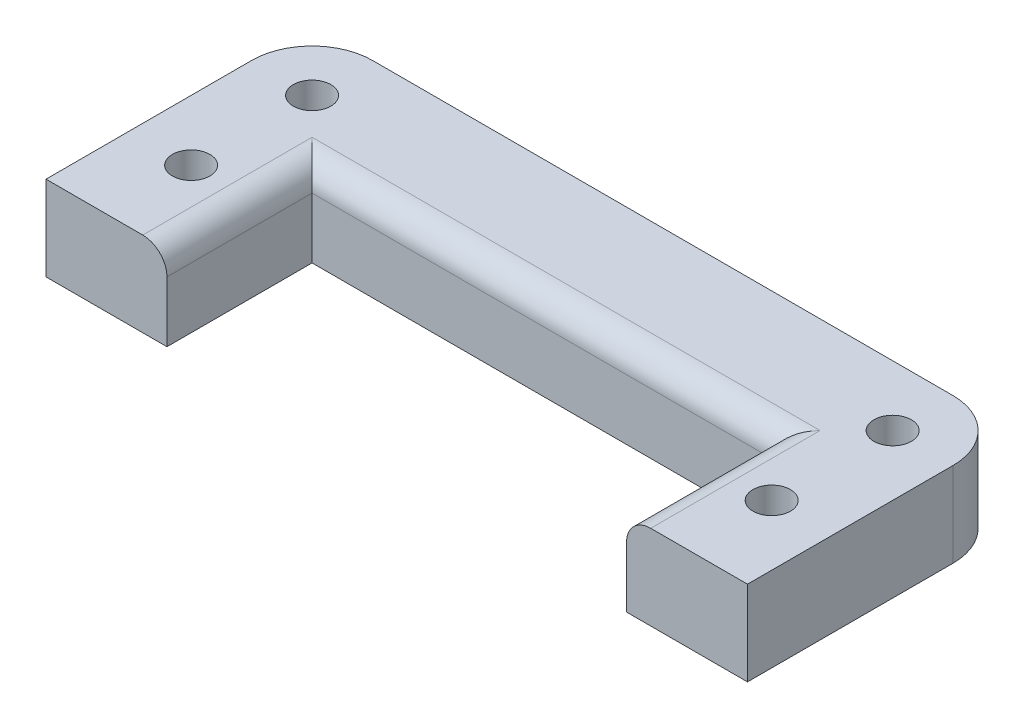
ISO-10303-21;
HEADER;
FILE_DESCRIPTION(('STEP AP214'),'2;1');
FILE_NAME('part.step','',(''),(''),'','','');
FILE_SCHEMA(('AUTOMOTIVE_DESIGN { 1 0 10303 214 1 1 1 1 }'));
ENDSEC;
DATA;
#1=APPLICATION_CONTEXT('core data for automotive mechanical design processes');
#2=APPLICATION_PROTOCOL_DEFINITION('international standard','automotive_design',2000,#1);
#3=PRODUCT_CONTEXT('',#1,'mechanical');
#4=PRODUCT('Part','Part','',(#3));
#5=PRODUCT_RELATED_PRODUCT_CATEGORY('part','',(#4));
#6=PRODUCT_DEFINITION_FORMATION('','',#4);
#7=PRODUCT_DEFINITION_CONTEXT('part definition',#1,'design');
#8=PRODUCT_DEFINITION('design','',#6,#7);
#9=PRODUCT_DEFINITION_SHAPE('','',#8);
#10=(LENGTH_UNIT() NAMED_UNIT(*) SI_UNIT(.MILLI.,.METRE.));
#11=(NAMED_UNIT(*) PLANE_ANGLE_UNIT() SI_UNIT($,.RADIAN.));
#12=(NAMED_UNIT(*) SI_UNIT($,.STERADIAN.) SOLID_ANGLE_UNIT());
#13=UNCERTAINTY_MEASURE_WITH_UNIT(LENGTH_MEASURE(1.E-05),#10,'distance_accuracy_value','');
#14=(GEOMETRIC_REPRESENTATION_CONTEXT(3) GLOBAL_UNCERTAINTY_ASSIGNED_CONTEXT((#13)) GLOBAL_UNIT_ASSIGNED_CONTEXT((#10,
#11,#12)) REPRESENTATION_CONTEXT('',''));
#15=CARTESIAN_POINT('',(0.,0.,0.));
#16=DIRECTION('',(0.,0.,1.));
#17=DIRECTION('',(1.,0.,0.));
#18=AXIS2_PLACEMENT_3D('',#15,#16,#17);
#19=CARTESIAN_POINT('',(0.,7.,0.));
#20=DIRECTION('',(0.,-1.,0.));
#21=DIRECTION('',(0.,0.,-1.));
#22=AXIS2_PLACEMENT_3D('',#19,#20,#21);
#23=PLANE('',#22);
#24=DIRECTION('',(-1.,0.,0.));
#25=VECTOR('',#24,1.);
#26=CARTESIAN_POINT('',(-29.,7.,-15.));
#27=LINE('',#26,#25);
#28=CARTESIAN_POINT('',(24.,7.,-15.));
#29=VERTEX_POINT('',#28);
#30=CARTESIAN_POINT('',(-24.,7.,-15.));
#31=VERTEX_POINT('',#30);
#32=EDGE_CURVE('E160',#29,#31,#27,.T.);
#33=ORIENTED_EDGE('',*,*,#32,.T.);
#34=CARTESIAN_POINT('',(-24.,7.,-10.));
#35=DIRECTION('',(0.,-1.,0.));
#36=DIRECTION('',(0.,0.,-1.));
#37=AXIS2_PLACEMENT_3D('',#34,#35,#36);
#38=CIRCLE('',#37,5.);
#39=CARTESIAN_POINT('',(-29.,7.,-9.99999999999999));
#40=VERTEX_POINT('',#39);
#41=EDGE_CURVE('E54',#31,#40,#38,.F.);
#42=ORIENTED_EDGE('',*,*,#41,.T.);
#43=DIRECTION('',(0.,0.,1.));
#44=VECTOR('',#43,1.);
#45=CARTESIAN_POINT('',(-29.,7.,7.00000000000001));
#46=LINE('',#45,#44);
#47=CARTESIAN_POINT('',(-29.,7.,7.00000000000001));
#48=VERTEX_POINT('',#47);
#49=EDGE_CURVE('E163',#40,#48,#46,.T.);
#50=ORIENTED_EDGE('',*,*,#49,.T.);
#51=DIRECTION('',(1.,0.,0.));
#52=VECTOR('',#51,1.);
#53=CARTESIAN_POINT('',(-19.,7.,7.));
#54=LINE('',#53,#52);
#55=CARTESIAN_POINT('',(-21.,7.,7.00000000000001));
#56=VERTEX_POINT('',#55);
#57=EDGE_CURVE('E146',#48,#56,#54,.T.);
#58=ORIENTED_EDGE('',*,*,#57,.T.);
#59=DIRECTION('',(0.,0.,-1.));
#60=VECTOR('',#59,1.);
#61=CARTESIAN_POINT('',(-21.,7.,0.));
#62=LINE('',#61,#60);
#63=CARTESIAN_POINT('',(-21.,7.,-6.99999999999999));
#64=VERTEX_POINT('',#63);
#65=EDGE_CURVE('E211',#56,#64,#62,.T.);
#66=ORIENTED_EDGE('',*,*,#65,.T.);
#67=DIRECTION('',(1.,0.,0.));
#68=VECTOR('',#67,1.);
#69=CARTESIAN_POINT('',(0.,7.,-6.99999999999999));
#70=LINE('',#69,#68);
#71=CARTESIAN_POINT('',(21.,7.,-6.99999999999999));
#72=VERTEX_POINT('',#71);
#73=EDGE_CURVE('E214',#64,#72,#70,.T.);
#74=ORIENTED_EDGE('',*,*,#73,.T.);
#75=DIRECTION('',(0.,0.,1.));
#76=VECTOR('',#75,1.);
#77=CARTESIAN_POINT('',(21.,7.,0.));
#78=LINE('',#77,#76);
#79=CARTESIAN_POINT('',(21.,7.,7.));
#80=VERTEX_POINT('',#79);
#81=EDGE_CURVE('E143',#72,#80,#78,.T.);
#82=ORIENTED_EDGE('',*,*,#81,.T.);
#83=DIRECTION('',(1.,0.,0.));
#84=VECTOR('',#83,1.);
#85=CARTESIAN_POINT('',(29.,7.,7.));
#86=LINE('',#85,#84);
#87=CARTESIAN_POINT('',(29.,7.,7.));
#88=VERTEX_POINT('',#87);
#89=EDGE_CURVE('E137',#80,#88,#86,.T.);
#90=ORIENTED_EDGE('',*,*,#89,.T.);
#91=DIRECTION('',(0.,0.,-1.));
#92=VECTOR('',#91,1.);
#93=CARTESIAN_POINT('',(29.,7.,-15.));
#94=LINE('',#93,#92);
#95=CARTESIAN_POINT('',(29.,7.,-10.));
#96=VERTEX_POINT('',#95);
#97=EDGE_CURVE('E140',#88,#96,#94,.T.);
#98=ORIENTED_EDGE('',*,*,#97,.T.);
#99=CARTESIAN_POINT('',(24.,7.,-10.));
#100=DIRECTION('',(0.,-1.,0.));
#101=DIRECTION('',(0.,0.,-1.));
#102=AXIS2_PLACEMENT_3D('',#99,#100,#101);
#103=CIRCLE('',#102,5.);
#104=EDGE_CURVE('E259',#96,#29,#103,.F.);
#105=ORIENTED_EDGE('',*,*,#104,.T.);
#106=EDGE_LOOP('',(#33,#42,#50,#58,#66,#74,#82,#90,#98,#105));
#107=FACE_BOUND('',#106,.T.);
#108=CARTESIAN_POINT('',(-24.,7.,0.));
#109=DIRECTION('',(0.,1.,0.));
#110=DIRECTION('',(0.,0.,1.));
#111=AXIS2_PLACEMENT_3D('',#108,#109,#110);
#112=CIRCLE('',#111,1.55);
#113=CARTESIAN_POINT('',(-24.,7.,1.55));
#114=VERTEX_POINT('',#113);
#115=EDGE_CURVE('E174',#114,#114,#112,.T.);
#116=ORIENTED_EDGE('',*,*,#115,.F.);
#117=EDGE_LOOP('',(#116));
#118=FACE_BOUND('',#117,.T.);
#119=CARTESIAN_POINT('',(24.,7.,0.));
#120=DIRECTION('',(0.,1.,0.));
#121=DIRECTION('',(0.,0.,1.));
#122=AXIS2_PLACEMENT_3D('',#119,#120,#121);
#123=CIRCLE('',#122,1.55);
#124=CARTESIAN_POINT('',(24.,7.,1.55));
#125=VERTEX_POINT('',#124);
#126=EDGE_CURVE('E307',#125,#125,#123,.T.);
#127=ORIENTED_EDGE('',*,*,#126,.F.);
#128=EDGE_LOOP('',(#127));
#129=FACE_BOUND('',#128,.T.);
#130=CARTESIAN_POINT('',(-24.,7.,-10.));
#131=DIRECTION('',(0.,1.,0.));
#132=DIRECTION('',(0.,0.,1.));
#133=AXIS2_PLACEMENT_3D('',#130,#131,#132);
#134=CIRCLE('',#133,1.55);
#135=CARTESIAN_POINT('',(-24.,7.,-8.45));
#136=VERTEX_POINT('',#135);
#137=EDGE_CURVE('E315',#136,#136,#134,.T.);
#138=ORIENTED_EDGE('',*,*,#137,.F.);
#139=EDGE_LOOP('',(#138));
#140=FACE_BOUND('',#139,.T.);
#141=CARTESIAN_POINT('',(24.,7.,-10.));
#142=DIRECTION('',(0.,1.,0.));
#143=DIRECTION('',(0.,0.,1.));
#144=AXIS2_PLACEMENT_3D('',#141,#142,#143);
#145=CIRCLE('',#144,1.55);
#146=CARTESIAN_POINT('',(24.,7.,-8.45));
#147=VERTEX_POINT('',#146);
#148=EDGE_CURVE('E323',#147,#147,#145,.T.);
#149=ORIENTED_EDGE('',*,*,#148,.F.);
#150=EDGE_LOOP('',(#149));
#151=FACE_BOUND('',#150,.T.);
#152=ADVANCED_FACE('F45',(#107,#118,#129,#140,#151),#23,.F.);
#153=CARTESIAN_POINT('',(0.,0.,0.));
#154=DIRECTION('',(0.,-1.,0.));
#155=DIRECTION('',(0.,0.,-1.));
#156=AXIS2_PLACEMENT_3D('',#153,#154,#155);
#157=PLANE('',#156);
#158=CARTESIAN_POINT('',(-24.,0.,-10.));
#159=DIRECTION('',(0.,1.,0.));
#160=DIRECTION('',(0.,0.,1.));
#161=AXIS2_PLACEMENT_3D('',#158,#159,#160);
#162=CIRCLE('',#161,1.55);
#163=CARTESIAN_POINT('',(-24.,0.,-8.45));
#164=VERTEX_POINT('',#163);
#165=EDGE_CURVE('E319',#164,#164,#162,.T.);
#166=ORIENTED_EDGE('',*,*,#165,.T.);
#167=EDGE_LOOP('',(#166));
#168=FACE_BOUND('',#167,.T.);
#169=CARTESIAN_POINT('',(-24.,0.,0.));
#170=DIRECTION('',(0.,1.,0.));
#171=DIRECTION('',(0.,0.,1.));
#172=AXIS2_PLACEMENT_3D('',#169,#170,#171);
#173=CIRCLE('',#172,1.55);
#174=CARTESIAN_POINT('',(-24.,0.,1.55));
#175=VERTEX_POINT('',#174);
#176=EDGE_CURVE('E303',#175,#175,#173,.T.);
#177=ORIENTED_EDGE('',*,*,#176,.T.);
#178=EDGE_LOOP('',(#177));
#179=FACE_BOUND('',#178,.T.);
#180=DIRECTION('',(0.,0.,1.));
#181=VECTOR('',#180,1.);
#182=CARTESIAN_POINT('',(-29.,0.,7.00000000000001));
#183=LINE('',#182,#181);
#184=CARTESIAN_POINT('',(-29.,0.,-9.99999999999999));
#185=VERTEX_POINT('',#184);
#186=CARTESIAN_POINT('',(-29.,0.,7.00000000000001));
#187=VERTEX_POINT('',#186);
#188=EDGE_CURVE('E194',#185,#187,#183,.T.);
#189=ORIENTED_EDGE('',*,*,#188,.F.);
#190=CARTESIAN_POINT('',(-24.,0.,-10.));
#191=DIRECTION('',(0.,-1.,0.));
#192=DIRECTION('',(0.,0.,-1.));
#193=AXIS2_PLACEMENT_3D('',#190,#191,#192);
#194=CIRCLE('',#193,5.);
#195=CARTESIAN_POINT('',(-24.,0.,-15.));
#196=VERTEX_POINT('',#195);
#197=EDGE_CURVE('E250',#185,#196,#194,.T.);
#198=ORIENTED_EDGE('',*,*,#197,.T.);
#199=DIRECTION('',(-1.,0.,0.));
#200=VECTOR('',#199,1.);
#201=CARTESIAN_POINT('',(-29.,0.,-15.));
#202=LINE('',#201,#200);
#203=CARTESIAN_POINT('',(24.,0.,-15.));
#204=VERTEX_POINT('',#203);
#205=EDGE_CURVE('E191',#204,#196,#202,.T.);
#206=ORIENTED_EDGE('',*,*,#205,.F.);
#207=CARTESIAN_POINT('',(24.,0.,-10.));
#208=DIRECTION('',(0.,-1.,0.));
#209=DIRECTION('',(0.,0.,-1.));
#210=AXIS2_PLACEMENT_3D('',#207,#208,#209);
#211=CIRCLE('',#210,5.);
#212=CARTESIAN_POINT('',(29.,0.,-10.));
#213=VERTEX_POINT('',#212);
#214=EDGE_CURVE('E247',#204,#213,#211,.T.);
#215=ORIENTED_EDGE('',*,*,#214,.T.);
#216=DIRECTION('',(0.,0.,-1.));
#217=VECTOR('',#216,1.);
#218=CARTESIAN_POINT('',(29.,0.,-15.));
#219=LINE('',#218,#217);
#220=CARTESIAN_POINT('',(29.,0.,7.));
#221=VERTEX_POINT('',#220);
#222=EDGE_CURVE('E188',#221,#213,#219,.T.);
#223=ORIENTED_EDGE('',*,*,#222,.F.);
#224=DIRECTION('',(1.,0.,0.));
#225=VECTOR('',#224,1.);
#226=CARTESIAN_POINT('',(29.,0.,7.));
#227=LINE('',#226,#225);
#228=CARTESIAN_POINT('',(19.,0.,7.));
#229=VERTEX_POINT('',#228);
#230=EDGE_CURVE('E152',#229,#221,#227,.T.);
#231=ORIENTED_EDGE('',*,*,#230,.F.);
#232=DIRECTION('',(0.,0.,1.));
#233=VECTOR('',#232,1.);
#234=CARTESIAN_POINT('',(19.,0.,7.));
#235=LINE('',#234,#233);
#236=CARTESIAN_POINT('',(19.,0.,-4.99999999999999));
#237=VERTEX_POINT('',#236);
#238=EDGE_CURVE('E182',#237,#229,#235,.T.);
#239=ORIENTED_EDGE('',*,*,#238,.F.);
#240=DIRECTION('',(1.,0.,0.));
#241=VECTOR('',#240,1.);
#242=CARTESIAN_POINT('',(19.,0.,-4.99999999999999));
#243=LINE('',#242,#241);
#244=CARTESIAN_POINT('',(-19.,0.,-4.99999999999999));
#245=VERTEX_POINT('',#244);
#246=EDGE_CURVE('E178',#245,#237,#243,.T.);
#247=ORIENTED_EDGE('',*,*,#246,.F.);
#248=DIRECTION('',(0.,0.,-1.));
#249=VECTOR('',#248,1.);
#250=CARTESIAN_POINT('',(-19.,0.,-4.99999999999999));
#251=LINE('',#250,#249);
#252=CARTESIAN_POINT('',(-19.,0.,7.));
#253=VERTEX_POINT('',#252);
#254=EDGE_CURVE('E173',#253,#245,#251,.T.);
#255=ORIENTED_EDGE('',*,*,#254,.F.);
#256=DIRECTION('',(1.,0.,0.));
#257=VECTOR('',#256,1.);
#258=CARTESIAN_POINT('',(-19.,0.,7.));
#259=LINE('',#258,#257);
#260=EDGE_CURVE('E169',#187,#253,#259,.T.);
#261=ORIENTED_EDGE('',*,*,#260,.F.);
#262=EDGE_LOOP('',(#189,#198,#206,#215,#223,#231,#239,#247,#255,#261));
#263=FACE_BOUND('',#262,.T.);
#264=CARTESIAN_POINT('',(24.,0.,0.));
#265=DIRECTION('',(0.,1.,0.));
#266=DIRECTION('',(0.,0.,1.));
#267=AXIS2_PLACEMENT_3D('',#264,#265,#266);
#268=CIRCLE('',#267,1.55);
#269=CARTESIAN_POINT('',(24.,0.,1.55));
#270=VERTEX_POINT('',#269);
#271=EDGE_CURVE('E311',#270,#270,#268,.T.);
#272=ORIENTED_EDGE('',*,*,#271,.T.);
#273=EDGE_LOOP('',(#272));
#274=FACE_BOUND('',#273,.T.);
#275=CARTESIAN_POINT('',(24.,0.,-10.));
#276=DIRECTION('',(0.,1.,0.));
#277=DIRECTION('',(0.,0.,1.));
#278=AXIS2_PLACEMENT_3D('',#275,#276,#277);
#279=CIRCLE('',#278,1.55);
#280=CARTESIAN_POINT('',(24.,0.,-8.45));
#281=VERTEX_POINT('',#280);
#282=EDGE_CURVE('E243',#281,#281,#279,.T.);
#283=ORIENTED_EDGE('',*,*,#282,.T.);
#284=EDGE_LOOP('',(#283));
#285=FACE_BOUND('',#284,.T.);
#286=ADVANCED_FACE('F275',(#168,#179,#263,#274,#285),#157,.T.);
#287=CARTESIAN_POINT('',(-19.,7.,7.));
#288=DIRECTION('',(0.,0.,-1.));
#289=DIRECTION('',(-1.,0.,0.));
#290=AXIS2_PLACEMENT_3D('',#287,#288,#289);
#291=PLANE('',#290);
#292=DIRECTION('',(0.,-1.,0.));
#293=VECTOR('',#292,1.);
#294=CARTESIAN_POINT('',(-19.,7.,7.));
#295=LINE('',#294,#293);
#296=CARTESIAN_POINT('',(-19.,5.,7.));
#297=VERTEX_POINT('',#296);
#298=EDGE_CURVE('E208',#297,#253,#295,.T.);
#299=ORIENTED_EDGE('',*,*,#298,.F.);
#300=CARTESIAN_POINT('',(-21.,5.,7.00000000000001));
#301=DIRECTION('',(0.,0.,-1.));
#302=DIRECTION('',(-1.,0.,0.));
#303=AXIS2_PLACEMENT_3D('',#300,#301,#302);
#304=CIRCLE('',#303,2.);
#305=EDGE_CURVE('E231',#297,#56,#304,.F.);
#306=ORIENTED_EDGE('',*,*,#305,.T.);
#307=ORIENTED_EDGE('',*,*,#57,.F.);
#308=DIRECTION('',(0.,-1.,0.));
#309=VECTOR('',#308,1.);
#310=CARTESIAN_POINT('',(-29.,7.,7.00000000000001));
#311=LINE('',#310,#309);
#312=EDGE_CURVE('E156',#48,#187,#311,.T.);
#313=ORIENTED_EDGE('',*,*,#312,.T.);
#314=ORIENTED_EDGE('',*,*,#260,.T.);
#315=EDGE_LOOP('',(#299,#306,#307,#313,#314));
#316=FACE_BOUND('',#315,.T.);
#317=ADVANCED_FACE('F298',(#316),#291,.F.);
#318=CARTESIAN_POINT('',(-19.,7.,-4.99999999999999));
#319=DIRECTION('',(-1.,0.,0.));
#320=DIRECTION('',(0.,0.,1.));
#321=AXIS2_PLACEMENT_3D('',#318,#319,#320);
#322=PLANE('',#321);
#323=DIRECTION('',(0.,-1.,0.));
#324=VECTOR('',#323,1.);
#325=CARTESIAN_POINT('',(-19.,7.,-4.99999999999999));
#326=LINE('',#325,#324);
#327=CARTESIAN_POINT('',(-19.,5.,-4.99999999999999));
#328=VERTEX_POINT('',#327);
#329=EDGE_CURVE('E205',#328,#245,#326,.T.);
#330=ORIENTED_EDGE('',*,*,#329,.F.);
#331=DIRECTION('',(0.,0.,-1.));
#332=VECTOR('',#331,1.);
#333=CARTESIAN_POINT('',(-19.,5.,-4.99999999999999));
#334=LINE('',#333,#332);
#335=EDGE_CURVE('E228',#328,#297,#334,.F.);
#336=ORIENTED_EDGE('',*,*,#335,.T.);
#337=ORIENTED_EDGE('',*,*,#298,.T.);
#338=ORIENTED_EDGE('',*,*,#254,.T.);
#339=EDGE_LOOP('',(#330,#336,#337,#338));
#340=FACE_BOUND('',#339,.T.);
#341=ADVANCED_FACE('F295',(#340),#322,.F.);
#342=CARTESIAN_POINT('',(19.,7.,-4.99999999999999));
#343=DIRECTION('',(0.,0.,-1.));
#344=DIRECTION('',(-1.,0.,0.));
#345=AXIS2_PLACEMENT_3D('',#342,#343,#344);
#346=PLANE('',#345);
#347=DIRECTION('',(0.,-1.,0.));
#348=VECTOR('',#347,1.);
#349=CARTESIAN_POINT('',(19.,7.,-4.99999999999999));
#350=LINE('',#349,#348);
#351=CARTESIAN_POINT('',(19.,5.,-4.99999999999999));
#352=VERTEX_POINT('',#351);
#353=EDGE_CURVE('E202',#352,#237,#350,.T.);
#354=ORIENTED_EDGE('',*,*,#353,.F.);
#355=DIRECTION('',(1.,0.,0.));
#356=VECTOR('',#355,1.);
#357=CARTESIAN_POINT('',(19.,5.,-4.99999999999999));
#358=LINE('',#357,#356);
#359=EDGE_CURVE('E225',#352,#328,#358,.F.);
#360=ORIENTED_EDGE('',*,*,#359,.T.);
#361=ORIENTED_EDGE('',*,*,#329,.T.);
#362=ORIENTED_EDGE('',*,*,#246,.T.);
#363=EDGE_LOOP('',(#354,#360,#361,#362));
#364=FACE_BOUND('',#363,.T.);
#365=ADVANCED_FACE('F291',(#364),#346,.F.);
#366=CARTESIAN_POINT('',(19.,7.,7.));
#367=DIRECTION('',(1.,0.,0.));
#368=DIRECTION('',(0.,0.,-1.));
#369=AXIS2_PLACEMENT_3D('',#366,#367,#368);
#370=PLANE('',#369);
#371=DIRECTION('',(0.,-1.,0.));
#372=VECTOR('',#371,1.);
#373=CARTESIAN_POINT('',(19.,7.,7.));
#374=LINE('',#373,#372);
#375=CARTESIAN_POINT('',(19.,5.,7.));
#376=VERTEX_POINT('',#375);
#377=EDGE_CURVE('E155',#376,#229,#374,.T.);
#378=ORIENTED_EDGE('',*,*,#377,.F.);
#379=DIRECTION('',(0.,0.,1.));
#380=VECTOR('',#379,1.);
#381=CARTESIAN_POINT('',(19.,5.,7.));
#382=LINE('',#381,#380);
#383=EDGE_CURVE('E222',#376,#352,#382,.F.);
#384=ORIENTED_EDGE('',*,*,#383,.T.);
#385=ORIENTED_EDGE('',*,*,#353,.T.);
#386=ORIENTED_EDGE('',*,*,#238,.T.);
#387=EDGE_LOOP('',(#378,#384,#385,#386));
#388=FACE_BOUND('',#387,.T.);
#389=ADVANCED_FACE('F286',(#388),#370,.F.);
#390=CARTESIAN_POINT('',(29.,7.,7.));
#391=DIRECTION('',(0.,0.,-1.));
#392=DIRECTION('',(-1.,0.,0.));
#393=AXIS2_PLACEMENT_3D('',#390,#391,#392);
#394=PLANE('',#393);
#395=ORIENTED_EDGE('',*,*,#89,.F.);
#396=CARTESIAN_POINT('',(21.,5.,7.));
#397=DIRECTION('',(0.,0.,-1.));
#398=DIRECTION('',(-1.,0.,0.));
#399=AXIS2_PLACEMENT_3D('',#396,#397,#398);
#400=CIRCLE('',#399,2.);
#401=EDGE_CURVE('E219',#80,#376,#400,.F.);
#402=ORIENTED_EDGE('',*,*,#401,.T.);
#403=ORIENTED_EDGE('',*,*,#377,.T.);
#404=ORIENTED_EDGE('',*,*,#230,.T.);
#405=DIRECTION('',(0.,-1.,0.));
#406=VECTOR('',#405,1.);
#407=CARTESIAN_POINT('',(29.,7.,7.));
#408=LINE('',#407,#406);
#409=EDGE_CURVE('E149',#88,#221,#408,.T.);
#410=ORIENTED_EDGE('',*,*,#409,.F.);
#411=EDGE_LOOP('',(#395,#402,#403,#404,#410));
#412=FACE_BOUND('',#411,.T.);
#413=ADVANCED_FACE('F150',(#412),#394,.F.);
#414=CARTESIAN_POINT('',(29.,7.,-15.));
#415=DIRECTION('',(-1.,0.,0.));
#416=DIRECTION('',(0.,0.,1.));
#417=AXIS2_PLACEMENT_3D('',#414,#415,#416);
#418=PLANE('',#417);
#419=ORIENTED_EDGE('',*,*,#222,.T.);
#420=DIRECTION('',(0.,-1.,0.));
#421=VECTOR('',#420,1.);
#422=CARTESIAN_POINT('',(29.,7.,-10.));
#423=LINE('',#422,#421);
#424=EDGE_CURVE('E11',#213,#96,#423,.F.);
#425=ORIENTED_EDGE('',*,*,#424,.T.);
#426=ORIENTED_EDGE('',*,*,#97,.F.);
#427=ORIENTED_EDGE('',*,*,#409,.T.);
#428=EDGE_LOOP('',(#419,#425,#426,#427));
#429=FACE_BOUND('',#428,.T.);
#430=ADVANCED_FACE('F158',(#429),#418,.F.);
#431=CARTESIAN_POINT('',(-29.,7.,-15.));
#432=DIRECTION('',(0.,0.,1.));
#433=DIRECTION('',(1.,0.,0.));
#434=AXIS2_PLACEMENT_3D('',#431,#432,#433);
#435=PLANE('',#434);
#436=ORIENTED_EDGE('',*,*,#205,.T.);
#437=DIRECTION('',(0.,-1.,0.));
#438=VECTOR('',#437,1.);
#439=CARTESIAN_POINT('',(-24.,7.,-15.));
#440=LINE('',#439,#438);
#441=EDGE_CURVE('E67',#196,#31,#440,.F.);
#442=ORIENTED_EDGE('',*,*,#441,.T.);
#443=ORIENTED_EDGE('',*,*,#32,.F.);
#444=DIRECTION('',(0.,-1.,0.));
#445=VECTOR('',#444,1.);
#446=CARTESIAN_POINT('',(24.,7.,-15.));
#447=LINE('',#446,#445);
#448=EDGE_CURVE('E253',#29,#204,#447,.T.);
#449=ORIENTED_EDGE('',*,*,#448,.T.);
#450=EDGE_LOOP('',(#436,#442,#443,#449));
#451=FACE_BOUND('',#450,.T.);
#452=ADVANCED_FACE('F278',(#451),#435,.F.);
#453=CARTESIAN_POINT('',(-29.,7.,7.00000000000001));
#454=DIRECTION('',(1.,0.,0.));
#455=DIRECTION('',(0.,0.,-1.));
#456=AXIS2_PLACEMENT_3D('',#453,#454,#455);
#457=PLANE('',#456);
#458=ORIENTED_EDGE('',*,*,#49,.F.);
#459=DIRECTION('',(0.,-1.,0.));
#460=VECTOR('',#459,1.);
#461=CARTESIAN_POINT('',(-29.,7.,-9.99999999999999));
#462=LINE('',#461,#460);
#463=EDGE_CURVE('E234',#40,#185,#462,.T.);
#464=ORIENTED_EDGE('',*,*,#463,.T.);
#465=ORIENTED_EDGE('',*,*,#188,.T.);
#466=ORIENTED_EDGE('',*,*,#312,.F.);
#467=EDGE_LOOP('',(#458,#464,#465,#466));
#468=FACE_BOUND('',#467,.T.);
#469=ADVANCED_FACE('F269',(#468),#457,.F.);
#470=CARTESIAN_POINT('',(-24.,7.,0.));
#471=DIRECTION('',(0.,-1.,0.));
#472=DIRECTION('',(0.,0.,-1.));
#473=AXIS2_PLACEMENT_3D('',#470,#471,#472);
#474=CYLINDRICAL_SURFACE('',#473,1.55);
#475=ORIENTED_EDGE('',*,*,#115,.T.);
#476=EDGE_LOOP('',(#475));
#477=FACE_BOUND('',#476,.T.);
#478=ORIENTED_EDGE('',*,*,#176,.F.);
#479=EDGE_LOOP('',(#478));
#480=FACE_BOUND('',#479,.T.);
#481=ADVANCED_FACE('F346',(#477,#480),#474,.F.);
#482=CARTESIAN_POINT('',(24.,7.,0.));
#483=DIRECTION('',(0.,-1.,0.));
#484=DIRECTION('',(0.,0.,-1.));
#485=AXIS2_PLACEMENT_3D('',#482,#483,#484);
#486=CYLINDRICAL_SURFACE('',#485,1.55);
#487=ORIENTED_EDGE('',*,*,#126,.T.);
#488=EDGE_LOOP('',(#487));
#489=FACE_BOUND('',#488,.T.);
#490=ORIENTED_EDGE('',*,*,#271,.F.);
#491=EDGE_LOOP('',(#490));
#492=FACE_BOUND('',#491,.T.);
#493=ADVANCED_FACE('F422',(#489,#492),#486,.F.);
#494=CARTESIAN_POINT('',(-24.,7.,-10.));
#495=DIRECTION('',(0.,-1.,0.));
#496=DIRECTION('',(0.,0.,-1.));
#497=AXIS2_PLACEMENT_3D('',#494,#495,#496);
#498=CYLINDRICAL_SURFACE('',#497,1.55);
#499=ORIENTED_EDGE('',*,*,#137,.T.);
#500=EDGE_LOOP('',(#499));
#501=FACE_BOUND('',#500,.T.);
#502=ORIENTED_EDGE('',*,*,#165,.F.);
#503=EDGE_LOOP('',(#502));
#504=FACE_BOUND('',#503,.T.);
#505=ADVANCED_FACE('F413',(#501,#504),#498,.F.);
#506=CARTESIAN_POINT('',(24.,7.,-10.));
#507=DIRECTION('',(0.,-1.,0.));
#508=DIRECTION('',(0.,0.,-1.));
#509=AXIS2_PLACEMENT_3D('',#506,#507,#508);
#510=CYLINDRICAL_SURFACE('',#509,1.55);
#511=ORIENTED_EDGE('',*,*,#148,.T.);
#512=EDGE_LOOP('',(#511));
#513=FACE_BOUND('',#512,.T.);
#514=ORIENTED_EDGE('',*,*,#282,.F.);
#515=EDGE_LOOP('',(#514));
#516=FACE_BOUND('',#515,.T.);
#517=ADVANCED_FACE('F334',(#513,#516),#510,.F.);
#518=CARTESIAN_POINT('',(-21.,5.,0.));
#519=DIRECTION('',(0.,0.,-1.));
#520=DIRECTION('',(-1.,0.,0.));
#521=AXIS2_PLACEMENT_3D('',#518,#519,#520);
#522=CYLINDRICAL_SURFACE('',#521,2.);
#523=ORIENTED_EDGE('',*,*,#305,.F.);
#524=ORIENTED_EDGE('',*,*,#335,.F.);
#525=CARTESIAN_POINT('',(-21.,5.,-6.99999999999999));
#526=DIRECTION('',(0.707106781186548,0.,-0.707106781186547));
#527=DIRECTION('',(0.707106781186547,0.,0.707106781186548));
#528=AXIS2_PLACEMENT_3D('',#525,#526,#527);
#529=ELLIPSE('',#528,2.82842712474619,2.);
#530=EDGE_CURVE('E239',#64,#328,#529,.T.);
#531=ORIENTED_EDGE('',*,*,#530,.F.);
#532=ORIENTED_EDGE('',*,*,#65,.F.);
#533=EDGE_LOOP('',(#523,#524,#531,#532));
#534=FACE_BOUND('',#533,.T.);
#535=ADVANCED_FACE('F371',(#534),#522,.T.);
#536=CARTESIAN_POINT('',(0.,5.,-6.99999999999999));
#537=DIRECTION('',(1.,0.,0.));
#538=DIRECTION('',(0.,0.,-1.));
#539=AXIS2_PLACEMENT_3D('',#536,#537,#538);
#540=CYLINDRICAL_SURFACE('',#539,2.);
#541=ORIENTED_EDGE('',*,*,#530,.T.);
#542=ORIENTED_EDGE('',*,*,#359,.F.);
#543=CARTESIAN_POINT('',(21.,5.,-6.99999999999999));
#544=DIRECTION('',(0.707106781186548,0.,0.707106781186547));
#545=DIRECTION('',(-0.707106781186547,0.,0.707106781186548));
#546=AXIS2_PLACEMENT_3D('',#543,#544,#545);
#547=ELLIPSE('',#546,2.82842712474619,2.);
#548=EDGE_CURVE('E235',#72,#352,#547,.T.);
#549=ORIENTED_EDGE('',*,*,#548,.F.);
#550=ORIENTED_EDGE('',*,*,#73,.F.);
#551=EDGE_LOOP('',(#541,#542,#549,#550));
#552=FACE_BOUND('',#551,.T.);
#553=ADVANCED_FACE('F367',(#552),#540,.T.);
#554=CARTESIAN_POINT('',(21.,5.,0.));
#555=DIRECTION('',(0.,0.,1.));
#556=DIRECTION('',(1.,0.,0.));
#557=AXIS2_PLACEMENT_3D('',#554,#555,#556);
#558=CYLINDRICAL_SURFACE('',#557,2.);
#559=ORIENTED_EDGE('',*,*,#548,.T.);
#560=ORIENTED_EDGE('',*,*,#383,.F.);
#561=ORIENTED_EDGE('',*,*,#401,.F.);
#562=ORIENTED_EDGE('',*,*,#81,.F.);
#563=EDGE_LOOP('',(#559,#560,#561,#562));
#564=FACE_BOUND('',#563,.T.);
#565=ADVANCED_FACE('F365',(#564),#558,.T.);
#566=CARTESIAN_POINT('',(-24.,7.,-10.));
#567=DIRECTION('',(0.,-1.,0.));
#568=DIRECTION('',(0.,0.,-1.));
#569=AXIS2_PLACEMENT_3D('',#566,#567,#568);
#570=CYLINDRICAL_SURFACE('',#569,5.);
#571=ORIENTED_EDGE('',*,*,#41,.F.);
#572=ORIENTED_EDGE('',*,*,#441,.F.);
#573=ORIENTED_EDGE('',*,*,#197,.F.);
#574=ORIENTED_EDGE('',*,*,#463,.F.);
#575=EDGE_LOOP('',(#571,#572,#573,#574));
#576=FACE_BOUND('',#575,.T.);
#577=ADVANCED_FACE('F272',(#576),#570,.T.);
#578=CARTESIAN_POINT('',(24.,7.,-10.));
#579=DIRECTION('',(0.,-1.,0.));
#580=DIRECTION('',(0.,0.,-1.));
#581=AXIS2_PLACEMENT_3D('',#578,#579,#580);
#582=CYLINDRICAL_SURFACE('',#581,5.);
#583=ORIENTED_EDGE('',*,*,#104,.F.);
#584=ORIENTED_EDGE('',*,*,#424,.F.);
#585=ORIENTED_EDGE('',*,*,#214,.F.);
#586=ORIENTED_EDGE('',*,*,#448,.F.);
#587=EDGE_LOOP('',(#583,#584,#585,#586));
#588=FACE_BOUND('',#587,.T.);
#589=ADVANCED_FACE('F47',(#588),#582,.T.);
#590=CLOSED_SHELL('',(#152,#286,#317,#341,#365,#389,#413,#430,#452,#469,#481,#493,#505,#517,
#535,#553,#565,#577,#589));
#591=MANIFOLD_SOLID_BREP('B2',#590);
#592=ADVANCED_BREP_SHAPE_REPRESENTATION('',(#18,#591),#14);
#593=SHAPE_DEFINITION_REPRESENTATION(#9,#592);
ENDSEC;
END-ISO-10303-21;
